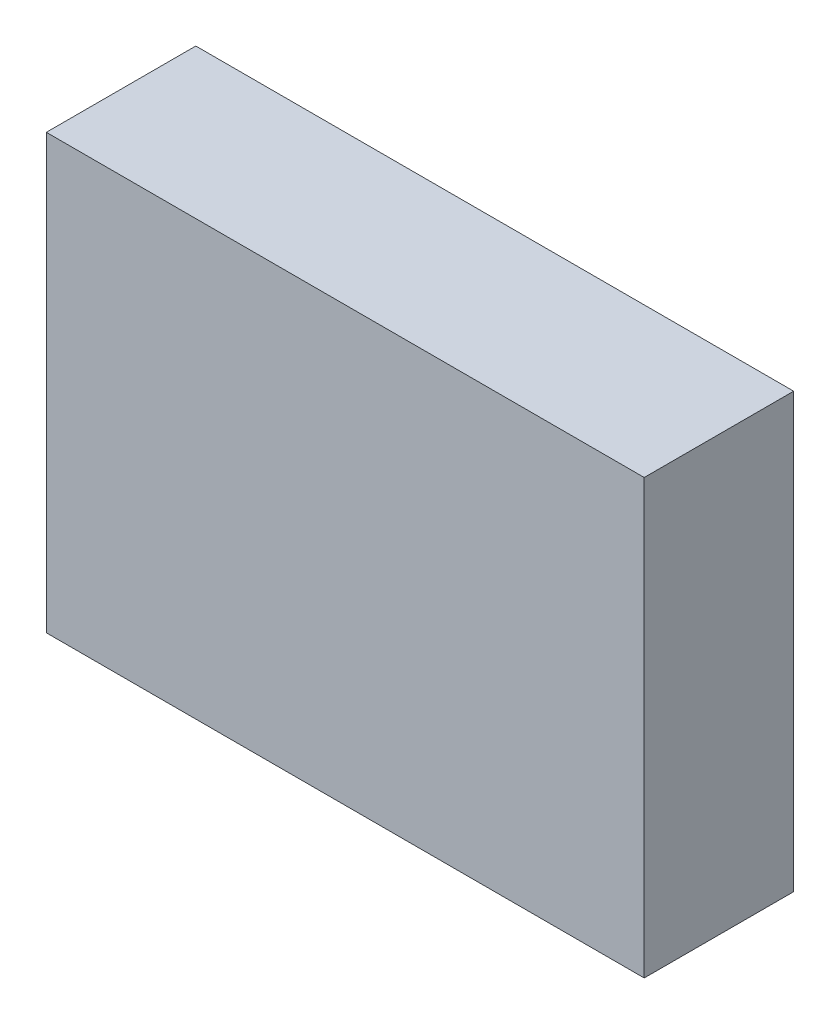
ISO-10303-21;
HEADER;
FILE_DESCRIPTION(('STEP AP214'),'2;1');
FILE_NAME('part.step','',(''),(''),'','','');
FILE_SCHEMA(('AUTOMOTIVE_DESIGN { 1 0 10303 214 1 1 1 1 }'));
ENDSEC;
DATA;
#1=APPLICATION_CONTEXT('core data for automotive mechanical design processes');
#2=APPLICATION_PROTOCOL_DEFINITION('international standard','automotive_design',2000,#1);
#3=PRODUCT_CONTEXT('',#1,'mechanical');
#4=PRODUCT('Part','Part','',(#3));
#5=PRODUCT_RELATED_PRODUCT_CATEGORY('part','',(#4));
#6=PRODUCT_DEFINITION_FORMATION('','',#4);
#7=PRODUCT_DEFINITION_CONTEXT('part definition',#1,'design');
#8=PRODUCT_DEFINITION('design','',#6,#7);
#9=PRODUCT_DEFINITION_SHAPE('','',#8);
#10=(LENGTH_UNIT() NAMED_UNIT(*) SI_UNIT(.MILLI.,.METRE.));
#11=(NAMED_UNIT(*) PLANE_ANGLE_UNIT() SI_UNIT($,.RADIAN.));
#12=(NAMED_UNIT(*) SI_UNIT($,.STERADIAN.) SOLID_ANGLE_UNIT());
#13=UNCERTAINTY_MEASURE_WITH_UNIT(LENGTH_MEASURE(1.E-05),#10,'distance_accuracy_value','');
#14=(GEOMETRIC_REPRESENTATION_CONTEXT(3) GLOBAL_UNCERTAINTY_ASSIGNED_CONTEXT((#13)) GLOBAL_UNIT_ASSIGNED_CONTEXT((#10,
#11,#12)) REPRESENTATION_CONTEXT('',''));
#15=CARTESIAN_POINT('',(0.,0.,0.));
#16=DIRECTION('',(0.,0.,1.));
#17=DIRECTION('',(1.,0.,0.));
#18=AXIS2_PLACEMENT_3D('',#15,#16,#17);
#19=CARTESIAN_POINT('',(0.,0.,10.));
#20=DIRECTION('',(1.,0.,0.));
#21=DIRECTION('',(0.,0.,-1.));
#22=AXIS2_PLACEMENT_3D('',#19,#20,#21);
#23=PLANE('',#22);
#24=DIRECTION('',(0.,-1.,0.));
#25=VECTOR('',#24,1.);
#26=CARTESIAN_POINT('',(0.,0.,0.));
#27=LINE('',#26,#25);
#28=CARTESIAN_POINT('',(0.,29.,0.));
#29=VERTEX_POINT('',#28);
#30=CARTESIAN_POINT('',(0.,0.,0.));
#31=VERTEX_POINT('',#30);
#32=EDGE_CURVE('E106',#29,#31,#27,.T.);
#33=ORIENTED_EDGE('',*,*,#32,.T.);
#34=DIRECTION('',(0.,0.,-1.));
#35=VECTOR('',#34,1.);
#36=CARTESIAN_POINT('',(0.,0.,10.));
#37=LINE('',#36,#35);
#38=CARTESIAN_POINT('',(0.,0.,10.));
#39=VERTEX_POINT('',#38);
#40=EDGE_CURVE('E11',#39,#31,#37,.T.);
#41=ORIENTED_EDGE('',*,*,#40,.F.);
#42=DIRECTION('',(0.,-1.,0.));
#43=VECTOR('',#42,1.);
#44=CARTESIAN_POINT('',(0.,0.,10.));
#45=LINE('',#44,#43);
#46=CARTESIAN_POINT('',(0.,29.,10.));
#47=VERTEX_POINT('',#46);
#48=EDGE_CURVE('E92',#47,#39,#45,.T.);
#49=ORIENTED_EDGE('',*,*,#48,.F.);
#50=DIRECTION('',(0.,0.,-1.));
#51=VECTOR('',#50,1.);
#52=CARTESIAN_POINT('',(0.,29.,10.));
#53=LINE('',#52,#51);
#54=EDGE_CURVE('E105',#47,#29,#53,.T.);
#55=ORIENTED_EDGE('',*,*,#54,.T.);
#56=EDGE_LOOP('',(#33,#41,#49,#55));
#57=FACE_BOUND('',#56,.T.);
#58=ADVANCED_FACE('F43',(#57),#23,.F.);
#59=CARTESIAN_POINT('',(0.,0.,10.));
#60=DIRECTION('',(0.,1.,0.));
#61=DIRECTION('',(0.,0.,1.));
#62=AXIS2_PLACEMENT_3D('',#59,#60,#61);
#63=PLANE('',#62);
#64=DIRECTION('',(1.,0.,0.));
#65=VECTOR('',#64,1.);
#66=CARTESIAN_POINT('',(0.,0.,0.));
#67=LINE('',#66,#65);
#68=CARTESIAN_POINT('',(40.,0.,0.));
#69=VERTEX_POINT('',#68);
#70=EDGE_CURVE('E97',#31,#69,#67,.T.);
#71=ORIENTED_EDGE('',*,*,#70,.T.);
#72=DIRECTION('',(0.,0.,-1.));
#73=VECTOR('',#72,1.);
#74=CARTESIAN_POINT('',(40.,0.,10.));
#75=LINE('',#74,#73);
#76=CARTESIAN_POINT('',(40.,0.,10.));
#77=VERTEX_POINT('',#76);
#78=EDGE_CURVE('E51',#77,#69,#75,.T.);
#79=ORIENTED_EDGE('',*,*,#78,.F.);
#80=DIRECTION('',(1.,0.,0.));
#81=VECTOR('',#80,1.);
#82=CARTESIAN_POINT('',(0.,0.,10.));
#83=LINE('',#82,#81);
#84=EDGE_CURVE('E87',#39,#77,#83,.T.);
#85=ORIENTED_EDGE('',*,*,#84,.F.);
#86=ORIENTED_EDGE('',*,*,#40,.T.);
#87=EDGE_LOOP('',(#71,#79,#85,#86));
#88=FACE_BOUND('',#87,.T.);
#89=ADVANCED_FACE('F100',(#88),#63,.F.);
#90=CARTESIAN_POINT('',(40.,0.,10.));
#91=DIRECTION('',(-1.,0.,0.));
#92=DIRECTION('',(0.,0.,1.));
#93=AXIS2_PLACEMENT_3D('',#90,#91,#92);
#94=PLANE('',#93);
#95=DIRECTION('',(0.,1.,0.));
#96=VECTOR('',#95,1.);
#97=CARTESIAN_POINT('',(40.,0.,0.));
#98=LINE('',#97,#96);
#99=CARTESIAN_POINT('',(40.,29.,0.));
#100=VERTEX_POINT('',#99);
#101=EDGE_CURVE('E78',#69,#100,#98,.T.);
#102=ORIENTED_EDGE('',*,*,#101,.T.);
#103=DIRECTION('',(0.,0.,-1.));
#104=VECTOR('',#103,1.);
#105=CARTESIAN_POINT('',(40.,29.,10.));
#106=LINE('',#105,#104);
#107=CARTESIAN_POINT('',(40.,29.,10.));
#108=VERTEX_POINT('',#107);
#109=EDGE_CURVE('E98',#108,#100,#106,.T.);
#110=ORIENTED_EDGE('',*,*,#109,.F.);
#111=DIRECTION('',(0.,1.,0.));
#112=VECTOR('',#111,1.);
#113=CARTESIAN_POINT('',(40.,0.,10.));
#114=LINE('',#113,#112);
#115=EDGE_CURVE('E95',#77,#108,#114,.T.);
#116=ORIENTED_EDGE('',*,*,#115,.F.);
#117=ORIENTED_EDGE('',*,*,#78,.T.);
#118=EDGE_LOOP('',(#102,#110,#116,#117));
#119=FACE_BOUND('',#118,.T.);
#120=ADVANCED_FACE('F99',(#119),#94,.F.);
#121=CARTESIAN_POINT('',(0.,29.,10.));
#122=DIRECTION('',(0.,-1.,0.));
#123=DIRECTION('',(0.,0.,-1.));
#124=AXIS2_PLACEMENT_3D('',#121,#122,#123);
#125=PLANE('',#124);
#126=DIRECTION('',(-1.,0.,0.));
#127=VECTOR('',#126,1.);
#128=CARTESIAN_POINT('',(0.,29.,0.));
#129=LINE('',#128,#127);
#130=EDGE_CURVE('E85',#100,#29,#129,.T.);
#131=ORIENTED_EDGE('',*,*,#130,.T.);
#132=ORIENTED_EDGE('',*,*,#54,.F.);
#133=DIRECTION('',(-1.,0.,0.));
#134=VECTOR('',#133,1.);
#135=CARTESIAN_POINT('',(0.,29.,10.));
#136=LINE('',#135,#134);
#137=EDGE_CURVE('E56',#108,#47,#136,.T.);
#138=ORIENTED_EDGE('',*,*,#137,.F.);
#139=ORIENTED_EDGE('',*,*,#109,.T.);
#140=EDGE_LOOP('',(#131,#132,#138,#139));
#141=FACE_BOUND('',#140,.T.);
#142=ADVANCED_FACE('F111',(#141),#125,.F.);
#143=CARTESIAN_POINT('',(0.,0.,10.));
#144=DIRECTION('',(0.,0.,-1.));
#145=DIRECTION('',(-1.,0.,0.));
#146=AXIS2_PLACEMENT_3D('',#143,#144,#145);
#147=PLANE('',#146);
#148=ORIENTED_EDGE('',*,*,#48,.T.);
#149=ORIENTED_EDGE('',*,*,#84,.T.);
#150=ORIENTED_EDGE('',*,*,#115,.T.);
#151=ORIENTED_EDGE('',*,*,#137,.T.);
#152=EDGE_LOOP('',(#148,#149,#150,#151));
#153=FACE_BOUND('',#152,.T.);
#154=ADVANCED_FACE('F89',(#153),#147,.F.);
#155=CARTESIAN_POINT('',(0.,0.,0.));
#156=DIRECTION('',(0.,0.,-1.));
#157=DIRECTION('',(-1.,0.,0.));
#158=AXIS2_PLACEMENT_3D('',#155,#156,#157);
#159=PLANE('',#158);
#160=ORIENTED_EDGE('',*,*,#32,.F.);
#161=ORIENTED_EDGE('',*,*,#130,.F.);
#162=ORIENTED_EDGE('',*,*,#101,.F.);
#163=ORIENTED_EDGE('',*,*,#70,.F.);
#164=EDGE_LOOP('',(#160,#161,#162,#163));
#165=FACE_BOUND('',#164,.T.);
#166=ADVANCED_FACE('F116',(#165),#159,.T.);
#167=CLOSED_SHELL('',(#58,#89,#120,#142,#154,#166));
#168=MANIFOLD_SOLID_BREP('B2',#167);
#169=ADVANCED_BREP_SHAPE_REPRESENTATION('',(#18,#168),#14);
#170=SHAPE_DEFINITION_REPRESENTATION(#9,#169);
ENDSEC;
END-ISO-10303-21;
